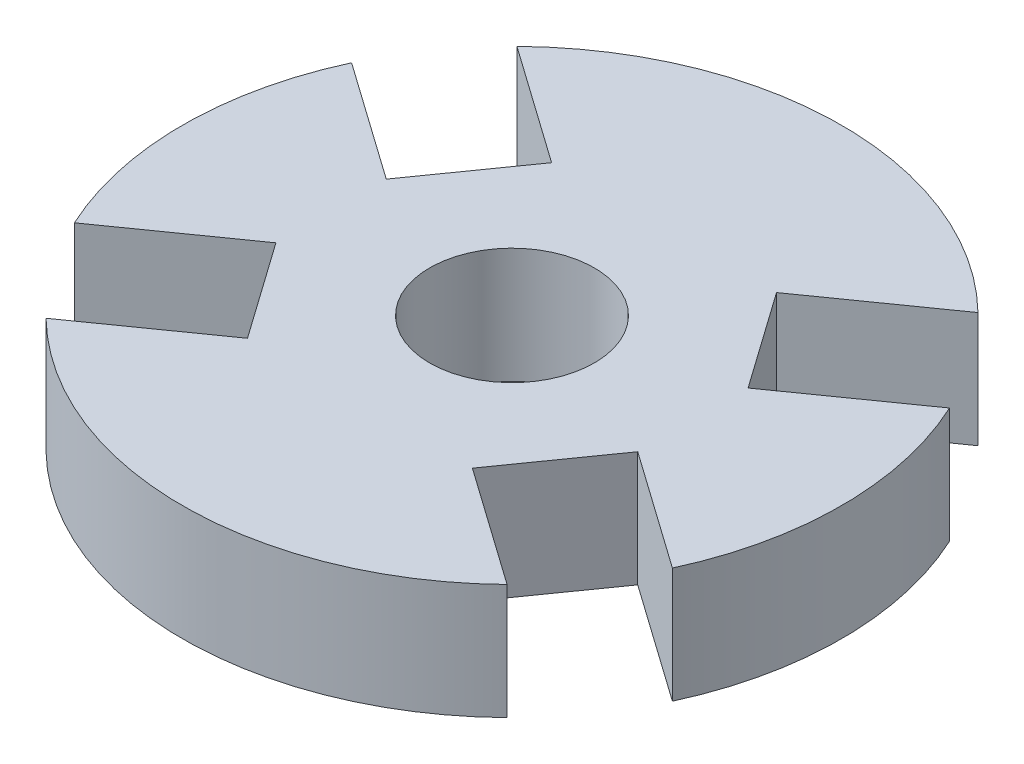
ISO-10303-21;
HEADER;
FILE_DESCRIPTION(('STEP AP214'),'2;1');
FILE_NAME('part.step','',(''),(''),'','','');
FILE_SCHEMA(('AUTOMOTIVE_DESIGN { 1 0 10303 214 1 1 1 1 }'));
ENDSEC;
DATA;
#1=APPLICATION_CONTEXT('core data for automotive mechanical design processes');
#2=APPLICATION_PROTOCOL_DEFINITION('international standard','automotive_design',2000,#1);
#3=PRODUCT_CONTEXT('',#1,'mechanical');
#4=PRODUCT('Part','Part','',(#3));
#5=PRODUCT_RELATED_PRODUCT_CATEGORY('part','',(#4));
#6=PRODUCT_DEFINITION_FORMATION('','',#4);
#7=PRODUCT_DEFINITION_CONTEXT('part definition',#1,'design');
#8=PRODUCT_DEFINITION('design','',#6,#7);
#9=PRODUCT_DEFINITION_SHAPE('','',#8);
#10=(LENGTH_UNIT() NAMED_UNIT(*) SI_UNIT(.MILLI.,.METRE.));
#11=(NAMED_UNIT(*) PLANE_ANGLE_UNIT() SI_UNIT($,.RADIAN.));
#12=(NAMED_UNIT(*) SI_UNIT($,.STERADIAN.) SOLID_ANGLE_UNIT());
#13=UNCERTAINTY_MEASURE_WITH_UNIT(LENGTH_MEASURE(1.E-05),#10,'distance_accuracy_value','');
#14=(GEOMETRIC_REPRESENTATION_CONTEXT(3) GLOBAL_UNCERTAINTY_ASSIGNED_CONTEXT((#13)) GLOBAL_UNIT_ASSIGNED_CONTEXT((#10,
#11,#12)) REPRESENTATION_CONTEXT('',''));
#15=CARTESIAN_POINT('',(0.,0.,0.));
#16=DIRECTION('',(0.,0.,1.));
#17=DIRECTION('',(1.,0.,0.));
#18=AXIS2_PLACEMENT_3D('',#15,#16,#17);
#19=CARTESIAN_POINT('',(0.,3.5,0.));
#20=DIRECTION('',(0.,-1.,0.));
#21=DIRECTION('',(0.,0.,-1.));
#22=AXIS2_PLACEMENT_3D('',#19,#20,#21);
#23=CYLINDRICAL_SURFACE('',#22,9.99999999999999);
#24=CARTESIAN_POINT('',(0.,0.,0.));
#25=DIRECTION('',(0.,1.,0.));
#26=DIRECTION('',(0.,0.,1.));
#27=AXIS2_PLACEMENT_3D('',#24,#25,#26);
#28=CIRCLE('',#27,9.99999999999999);
#29=CARTESIAN_POINT('',(6.99580233800451,0.,-7.14554054271407));
#30=VERTEX_POINT('',#29);
#31=CARTESIAN_POINT('',(-6.99580233800451,0.,-7.14554054271407));
#32=VERTEX_POINT('',#31);
#33=EDGE_CURVE('E254',#30,#32,#28,.T.);
#34=ORIENTED_EDGE('',*,*,#33,.T.);
#35=DIRECTION('',(0.,-1.,0.));
#36=VECTOR('',#35,1.);
#37=CARTESIAN_POINT('',(-6.99580233800451,3.5,-7.14554054271407));
#38=LINE('',#37,#36);
#39=CARTESIAN_POINT('',(-6.99580233800451,3.5,-7.14554054271407));
#40=VERTEX_POINT('',#39);
#41=EDGE_CURVE('E159',#32,#40,#38,.F.);
#42=ORIENTED_EDGE('',*,*,#41,.T.);
#43=CARTESIAN_POINT('',(0.,3.5,0.));
#44=DIRECTION('',(0.,1.,0.));
#45=DIRECTION('',(0.,0.,1.));
#46=AXIS2_PLACEMENT_3D('',#43,#44,#45);
#47=CIRCLE('',#46,9.99999999999999);
#48=CARTESIAN_POINT('',(6.99580233800451,3.5,-7.14554054271407));
#49=VERTEX_POINT('',#48);
#50=EDGE_CURVE('E248',#49,#40,#47,.T.);
#51=ORIENTED_EDGE('',*,*,#50,.F.);
#52=DIRECTION('',(0.,-1.,0.));
#53=VECTOR('',#52,1.);
#54=CARTESIAN_POINT('',(6.99580233800451,3.5,-7.14554054271407));
#55=LINE('',#54,#53);
#56=EDGE_CURVE('E261',#49,#30,#55,.T.);
#57=ORIENTED_EDGE('',*,*,#56,.T.);
#58=EDGE_LOOP('',(#34,#42,#51,#57));
#59=FACE_BOUND('',#58,.T.);
#60=ADVANCED_FACE('F33',(#59),#23,.T.);
#61=CARTESIAN_POINT('',(-6.99580233800451,0.,7.14554054271407));
#62=VERTEX_POINT('',#61);
#63=CARTESIAN_POINT('',(6.99580233800451,0.,7.14554054271407));
#64=VERTEX_POINT('',#63);
#65=EDGE_CURVE('E258',#62,#64,#28,.T.);
#66=ORIENTED_EDGE('',*,*,#65,.T.);
#67=DIRECTION('',(0.,-1.,0.));
#68=VECTOR('',#67,1.);
#69=CARTESIAN_POINT('',(6.99580233800451,3.5,7.14554054271407));
#70=LINE('',#69,#68);
#71=CARTESIAN_POINT('',(6.99580233800451,3.5,7.14554054271407));
#72=VERTEX_POINT('',#71);
#73=EDGE_CURVE('E41',#64,#72,#70,.F.);
#74=ORIENTED_EDGE('',*,*,#73,.T.);
#75=CARTESIAN_POINT('',(-6.99580233800451,3.5,7.14554054271407));
#76=VERTEX_POINT('',#75);
#77=EDGE_CURVE('E253',#76,#72,#47,.T.);
#78=ORIENTED_EDGE('',*,*,#77,.F.);
#79=DIRECTION('',(0.,-1.,0.));
#80=VECTOR('',#79,1.);
#81=CARTESIAN_POINT('',(-6.99580233800451,3.5,7.14554054271407));
#82=LINE('',#81,#80);
#83=EDGE_CURVE('E264',#76,#62,#82,.T.);
#84=ORIENTED_EDGE('',*,*,#83,.T.);
#85=EDGE_LOOP('',(#66,#74,#78,#84));
#86=FACE_BOUND('',#85,.T.);
#87=ADVANCED_FACE('F276',(#86),#23,.T.);
#88=CARTESIAN_POINT('',(-9.07285301820394,3.5,-4.20515613385133));
#89=VERTEX_POINT('',#88);
#90=CARTESIAN_POINT('',(-9.07285301820394,3.5,4.20515613385133));
#91=VERTEX_POINT('',#90);
#92=EDGE_CURVE('E252',#89,#91,#47,.T.);
#93=ORIENTED_EDGE('',*,*,#92,.F.);
#94=DIRECTION('',(0.,-1.,0.));
#95=VECTOR('',#94,1.);
#96=CARTESIAN_POINT('',(-9.07285301820394,3.5,-4.20515613385133));
#97=LINE('',#96,#95);
#98=CARTESIAN_POINT('',(-9.07285301820394,0.,-4.20515613385133));
#99=VERTEX_POINT('',#98);
#100=EDGE_CURVE('E152',#89,#99,#97,.T.);
#101=ORIENTED_EDGE('',*,*,#100,.T.);
#102=CARTESIAN_POINT('',(-9.07285301820394,0.,4.20515613385133));
#103=VERTEX_POINT('',#102);
#104=EDGE_CURVE('E257',#99,#103,#28,.T.);
#105=ORIENTED_EDGE('',*,*,#104,.T.);
#106=DIRECTION('',(0.,-1.,0.));
#107=VECTOR('',#106,1.);
#108=CARTESIAN_POINT('',(-9.07285301820394,3.5,4.20515613385133));
#109=LINE('',#108,#107);
#110=EDGE_CURVE('E267',#103,#91,#109,.F.);
#111=ORIENTED_EDGE('',*,*,#110,.T.);
#112=EDGE_LOOP('',(#93,#101,#105,#111));
#113=FACE_BOUND('',#112,.T.);
#114=ADVANCED_FACE('F300',(#113),#23,.T.);
#115=CARTESIAN_POINT('',(0.,3.5,0.));
#116=DIRECTION('',(0.,1.,0.));
#117=DIRECTION('',(0.,0.,1.));
#118=AXIS2_PLACEMENT_3D('',#115,#116,#117);
#119=PLANE('',#118);
#120=DIRECTION('',(-0.816773446906317,0.,-0.576958522277619));
#121=VECTOR('',#120,1.);
#122=CARTESIAN_POINT('',(-10.8455283123872,3.5,-9.86493870357073));
#123=LINE('',#122,#121);
#124=CARTESIAN_POINT('',(-3.4128899455397,3.5,-4.61461615084439));
#125=VERTEX_POINT('',#124);
#126=EDGE_CURVE('E167',#125,#40,#123,.T.);
#127=ORIENTED_EDGE('',*,*,#126,.F.);
#128=DIRECTION('',(0.576958522277619,0.,-0.816773446906317));
#129=VECTOR('',#128,1.);
#130=CARTESIAN_POINT('',(-5.48994062573913,3.5,-1.67423174198165));
#131=LINE('',#130,#129);
#132=CARTESIAN_POINT('',(-5.48994062573913,3.5,-1.67423174198165));
#133=VERTEX_POINT('',#132);
#134=EDGE_CURVE('E149',#133,#125,#131,.T.);
#135=ORIENTED_EDGE('',*,*,#134,.F.);
#136=DIRECTION('',(0.816773446906317,0.,0.576958522277619));
#137=VECTOR('',#136,1.);
#138=CARTESIAN_POINT('',(-12.9225789925866,3.5,-6.92455429470799));
#139=LINE('',#138,#137);
#140=EDGE_CURVE('E171',#89,#133,#139,.T.);
#141=ORIENTED_EDGE('',*,*,#140,.F.);
#142=ORIENTED_EDGE('',*,*,#92,.T.);
#143=DIRECTION('',(-0.816773446906316,0.,0.57695852227762));
#144=VECTOR('',#143,1.);
#145=CARTESIAN_POINT('',(-12.9225789925866,3.5,6.924554294708));
#146=LINE('',#145,#144);
#147=CARTESIAN_POINT('',(-5.48994062573913,3.5,1.67423174198165));
#148=VERTEX_POINT('',#147);
#149=EDGE_CURVE('E202',#148,#91,#146,.T.);
#150=ORIENTED_EDGE('',*,*,#149,.F.);
#151=DIRECTION('',(-0.57695852227762,0.,-0.816773446906316));
#152=VECTOR('',#151,1.);
#153=CARTESIAN_POINT('',(-3.4128899455397,3.5,4.61461615084439));
#154=LINE('',#153,#152);
#155=CARTESIAN_POINT('',(-3.4128899455397,3.5,4.61461615084439));
#156=VERTEX_POINT('',#155);
#157=EDGE_CURVE('E210',#156,#148,#154,.T.);
#158=ORIENTED_EDGE('',*,*,#157,.F.);
#159=DIRECTION('',(0.816773446906316,0.,-0.57695852227762));
#160=VECTOR('',#159,1.);
#161=CARTESIAN_POINT('',(-10.8455283123872,3.5,9.86493870357073));
#162=LINE('',#161,#160);
#163=EDGE_CURVE('E195',#76,#156,#162,.T.);
#164=ORIENTED_EDGE('',*,*,#163,.F.);
#165=ORIENTED_EDGE('',*,*,#77,.T.);
#166=DIRECTION('',(0.816773446906316,0.,0.57695852227762));
#167=VECTOR('',#166,1.);
#168=CARTESIAN_POINT('',(10.8455283123872,3.5,9.86493870357073));
#169=LINE('',#168,#167);
#170=CARTESIAN_POINT('',(3.4128899455397,3.5,4.61461615084439));
#171=VERTEX_POINT('',#170);
#172=EDGE_CURVE('E181',#171,#72,#169,.T.);
#173=ORIENTED_EDGE('',*,*,#172,.F.);
#174=DIRECTION('',(-0.576958522277619,0.,0.816773446906317));
#175=VECTOR('',#174,1.);
#176=CARTESIAN_POINT('',(3.4128899455397,3.5,4.61461615084439));
#177=LINE('',#176,#175);
#178=CARTESIAN_POINT('',(5.48994062573913,3.5,1.67423174198165));
#179=VERTEX_POINT('',#178);
#180=EDGE_CURVE('E189',#179,#171,#177,.T.);
#181=ORIENTED_EDGE('',*,*,#180,.F.);
#182=DIRECTION('',(-0.816773446906316,0.,-0.57695852227762));
#183=VECTOR('',#182,1.);
#184=CARTESIAN_POINT('',(12.9225789925866,3.5,6.92455429470799));
#185=LINE('',#184,#183);
#186=CARTESIAN_POINT('',(9.07285301820394,3.5,4.20515613385133));
#187=VERTEX_POINT('',#186);
#188=EDGE_CURVE('E178',#187,#179,#185,.T.);
#189=ORIENTED_EDGE('',*,*,#188,.F.);
#190=CARTESIAN_POINT('',(9.07285301820394,3.5,-4.20515613385133));
#191=VERTEX_POINT('',#190);
#192=EDGE_CURVE('E256',#187,#191,#47,.T.);
#193=ORIENTED_EDGE('',*,*,#192,.T.);
#194=DIRECTION('',(0.816773446906316,0.,-0.57695852227762));
#195=VECTOR('',#194,1.);
#196=CARTESIAN_POINT('',(12.9225789925866,3.5,-6.92455429470799));
#197=LINE('',#196,#195);
#198=CARTESIAN_POINT('',(5.48994062573913,3.5,-1.67423174198165));
#199=VERTEX_POINT('',#198);
#200=EDGE_CURVE('E233',#199,#191,#197,.T.);
#201=ORIENTED_EDGE('',*,*,#200,.F.);
#202=DIRECTION('',(0.576958522277619,0.,0.816773446906317));
#203=VECTOR('',#202,1.);
#204=CARTESIAN_POINT('',(5.48994062573913,3.5,-1.67423174198165));
#205=LINE('',#204,#203);
#206=CARTESIAN_POINT('',(3.4128899455397,3.5,-4.61461615084439));
#207=VERTEX_POINT('',#206);
#208=EDGE_CURVE('E217',#207,#199,#205,.T.);
#209=ORIENTED_EDGE('',*,*,#208,.F.);
#210=DIRECTION('',(-0.816773446906316,0.,0.57695852227762));
#211=VECTOR('',#210,1.);
#212=CARTESIAN_POINT('',(10.8455283123872,3.5,-9.86493870357073));
#213=LINE('',#212,#211);
#214=EDGE_CURVE('E224',#49,#207,#213,.T.);
#215=ORIENTED_EDGE('',*,*,#214,.F.);
#216=ORIENTED_EDGE('',*,*,#50,.T.);
#217=EDGE_LOOP('',(#127,#135,#141,#142,#150,#158,#164,#165,#173,#181,#189,#193,#201,#209,#215,#216));
#218=FACE_BOUND('',#217,.T.);
#219=CARTESIAN_POINT('',(0.,3.5,0.));
#220=DIRECTION('',(0.,1.,0.));
#221=DIRECTION('',(0.,0.,1.));
#222=AXIS2_PLACEMENT_3D('',#219,#220,#221);
#223=CIRCLE('',#222,2.5);
#224=CARTESIAN_POINT('',(0.,3.5,2.5));
#225=VERTEX_POINT('',#224);
#226=EDGE_CURVE('E242',#225,#225,#223,.T.);
#227=ORIENTED_EDGE('',*,*,#226,.F.);
#228=EDGE_LOOP('',(#227));
#229=FACE_BOUND('',#228,.T.);
#230=ADVANCED_FACE('F283',(#218,#229),#119,.T.);
#231=CARTESIAN_POINT('',(0.,0.,0.));
#232=DIRECTION('',(0.,1.,0.));
#233=DIRECTION('',(0.,0.,1.));
#234=AXIS2_PLACEMENT_3D('',#231,#232,#233);
#235=PLANE('',#234);
#236=DIRECTION('',(0.576958522277619,0.,-0.816773446906317));
#237=VECTOR('',#236,1.);
#238=CARTESIAN_POINT('',(-5.48994062573913,0.,-1.67423174198165));
#239=LINE('',#238,#237);
#240=CARTESIAN_POINT('',(-5.48994062573913,0.,-1.67423174198165));
#241=VERTEX_POINT('',#240);
#242=CARTESIAN_POINT('',(-3.4128899455397,0.,-4.61461615084439));
#243=VERTEX_POINT('',#242);
#244=EDGE_CURVE('E48',#241,#243,#239,.T.);
#245=ORIENTED_EDGE('',*,*,#244,.T.);
#246=DIRECTION('',(-0.816773446906317,0.,-0.576958522277619));
#247=VECTOR('',#246,1.);
#248=CARTESIAN_POINT('',(-10.8455283123872,0.,-9.86493870357073));
#249=LINE('',#248,#247);
#250=EDGE_CURVE('E156',#243,#32,#249,.T.);
#251=ORIENTED_EDGE('',*,*,#250,.T.);
#252=ORIENTED_EDGE('',*,*,#33,.F.);
#253=DIRECTION('',(-0.816773446906316,0.,0.57695852227762));
#254=VECTOR('',#253,1.);
#255=CARTESIAN_POINT('',(10.8455283123872,0.,-9.86493870357073));
#256=LINE('',#255,#254);
#257=CARTESIAN_POINT('',(3.4128899455397,0.,-4.61461615084439));
#258=VERTEX_POINT('',#257);
#259=EDGE_CURVE('E227',#30,#258,#256,.T.);
#260=ORIENTED_EDGE('',*,*,#259,.T.);
#261=DIRECTION('',(0.576958522277619,0.,0.816773446906317));
#262=VECTOR('',#261,1.);
#263=CARTESIAN_POINT('',(5.48994062573913,0.,-1.67423174198165));
#264=LINE('',#263,#262);
#265=CARTESIAN_POINT('',(5.48994062573913,0.,-1.67423174198165));
#266=VERTEX_POINT('',#265);
#267=EDGE_CURVE('E220',#258,#266,#264,.T.);
#268=ORIENTED_EDGE('',*,*,#267,.T.);
#269=DIRECTION('',(0.816773446906316,0.,-0.57695852227762));
#270=VECTOR('',#269,1.);
#271=CARTESIAN_POINT('',(12.9225789925866,0.,-6.92455429470799));
#272=LINE('',#271,#270);
#273=CARTESIAN_POINT('',(9.07285301820394,0.,-4.20515613385133));
#274=VERTEX_POINT('',#273);
#275=EDGE_CURVE('E223',#266,#274,#272,.T.);
#276=ORIENTED_EDGE('',*,*,#275,.T.);
#277=CARTESIAN_POINT('',(9.07285301820394,0.,4.20515613385133));
#278=VERTEX_POINT('',#277);
#279=EDGE_CURVE('E245',#278,#274,#28,.T.);
#280=ORIENTED_EDGE('',*,*,#279,.F.);
#281=DIRECTION('',(-0.816773446906316,0.,-0.57695852227762));
#282=VECTOR('',#281,1.);
#283=CARTESIAN_POINT('',(12.9225789925866,0.,6.92455429470799));
#284=LINE('',#283,#282);
#285=CARTESIAN_POINT('',(5.48994062573913,0.,1.67423174198165));
#286=VERTEX_POINT('',#285);
#287=EDGE_CURVE('E56',#278,#286,#284,.T.);
#288=ORIENTED_EDGE('',*,*,#287,.T.);
#289=DIRECTION('',(-0.576958522277619,0.,0.816773446906317));
#290=VECTOR('',#289,1.);
#291=CARTESIAN_POINT('',(3.4128899455397,0.,4.61461615084439));
#292=LINE('',#291,#290);
#293=CARTESIAN_POINT('',(3.4128899455397,0.,4.61461615084439));
#294=VERTEX_POINT('',#293);
#295=EDGE_CURVE('E180',#286,#294,#292,.T.);
#296=ORIENTED_EDGE('',*,*,#295,.T.);
#297=DIRECTION('',(0.816773446906316,0.,0.57695852227762));
#298=VECTOR('',#297,1.);
#299=CARTESIAN_POINT('',(10.8455283123872,0.,9.86493870357073));
#300=LINE('',#299,#298);
#301=EDGE_CURVE('E184',#294,#64,#300,.T.);
#302=ORIENTED_EDGE('',*,*,#301,.T.);
#303=ORIENTED_EDGE('',*,*,#65,.F.);
#304=DIRECTION('',(0.816773446906316,0.,-0.57695852227762));
#305=VECTOR('',#304,1.);
#306=CARTESIAN_POINT('',(-10.8455283123872,0.,9.86493870357073));
#307=LINE('',#306,#305);
#308=CARTESIAN_POINT('',(-3.4128899455397,0.,4.61461615084439));
#309=VERTEX_POINT('',#308);
#310=EDGE_CURVE('E198',#62,#309,#307,.T.);
#311=ORIENTED_EDGE('',*,*,#310,.T.);
#312=DIRECTION('',(-0.57695852227762,0.,-0.816773446906316));
#313=VECTOR('',#312,1.);
#314=CARTESIAN_POINT('',(-3.4128899455397,0.,4.61461615084439));
#315=LINE('',#314,#313);
#316=CARTESIAN_POINT('',(-5.48994062573913,0.,1.67423174198165));
#317=VERTEX_POINT('',#316);
#318=EDGE_CURVE('E201',#309,#317,#315,.T.);
#319=ORIENTED_EDGE('',*,*,#318,.T.);
#320=DIRECTION('',(-0.816773446906316,0.,0.57695852227762));
#321=VECTOR('',#320,1.);
#322=CARTESIAN_POINT('',(-12.9225789925866,0.,6.924554294708));
#323=LINE('',#322,#321);
#324=EDGE_CURVE('E205',#317,#103,#323,.T.);
#325=ORIENTED_EDGE('',*,*,#324,.T.);
#326=ORIENTED_EDGE('',*,*,#104,.F.);
#327=DIRECTION('',(0.816773446906317,0.,0.576958522277619));
#328=VECTOR('',#327,1.);
#329=CARTESIAN_POINT('',(-1.03852534009971,0.,1.47019220443137));
#330=LINE('',#329,#328);
#331=EDGE_CURVE('E11',#99,#241,#330,.T.);
#332=ORIENTED_EDGE('',*,*,#331,.T.);
#333=EDGE_LOOP('',(#245,#251,#252,#260,#268,#276,#280,#288,#296,#302,#303,#311,#319,#325,#326,#332));
#334=FACE_BOUND('',#333,.T.);
#335=CARTESIAN_POINT('',(0.,0.,0.));
#336=DIRECTION('',(0.,1.,0.));
#337=DIRECTION('',(0.,0.,1.));
#338=AXIS2_PLACEMENT_3D('',#335,#336,#337);
#339=CIRCLE('',#338,2.5);
#340=CARTESIAN_POINT('',(0.,0.,2.5));
#341=VERTEX_POINT('',#340);
#342=EDGE_CURVE('E240',#341,#341,#339,.T.);
#343=ORIENTED_EDGE('',*,*,#342,.T.);
#344=EDGE_LOOP('',(#343));
#345=FACE_BOUND('',#344,.T.);
#346=ADVANCED_FACE('F164',(#334,#345),#235,.F.);
#347=ORIENTED_EDGE('',*,*,#192,.F.);
#348=DIRECTION('',(0.,-1.,0.));
#349=VECTOR('',#348,1.);
#350=CARTESIAN_POINT('',(9.07285301820394,3.5,4.20515613385133));
#351=LINE('',#350,#349);
#352=EDGE_CURVE('E270',#187,#278,#351,.T.);
#353=ORIENTED_EDGE('',*,*,#352,.T.);
#354=ORIENTED_EDGE('',*,*,#279,.T.);
#355=DIRECTION('',(0.,-1.,0.));
#356=VECTOR('',#355,1.);
#357=CARTESIAN_POINT('',(9.07285301820394,3.5,-4.20515613385133));
#358=LINE('',#357,#356);
#359=EDGE_CURVE('E251',#274,#191,#358,.F.);
#360=ORIENTED_EDGE('',*,*,#359,.T.);
#361=EDGE_LOOP('',(#347,#353,#354,#360));
#362=FACE_BOUND('',#361,.T.);
#363=ADVANCED_FACE('F35',(#362),#23,.T.);
#364=CARTESIAN_POINT('',(0.,3.5,0.));
#365=DIRECTION('',(0.,-1.,0.));
#366=DIRECTION('',(0.,0.,-1.));
#367=AXIS2_PLACEMENT_3D('',#364,#365,#366);
#368=CYLINDRICAL_SURFACE('',#367,2.5);
#369=ORIENTED_EDGE('',*,*,#226,.T.);
#370=EDGE_LOOP('',(#369));
#371=FACE_BOUND('',#370,.T.);
#372=ORIENTED_EDGE('',*,*,#342,.F.);
#373=EDGE_LOOP('',(#372));
#374=FACE_BOUND('',#373,.T.);
#375=ADVANCED_FACE('F327',(#371,#374),#368,.F.);
#376=CARTESIAN_POINT('',(10.8455283123872,0.,-9.86493870357073));
#377=DIRECTION('',(-0.57695852227762,0.,-0.816773446906316));
#378=DIRECTION('',(-0.816773446906317,0.,0.57695852227762));
#379=AXIS2_PLACEMENT_3D('',#376,#377,#378);
#380=PLANE('',#379);
#381=ORIENTED_EDGE('',*,*,#214,.T.);
#382=DIRECTION('',(0.,1.,0.));
#383=VECTOR('',#382,1.);
#384=CARTESIAN_POINT('',(3.4128899455397,0.,-4.61461615084439));
#385=LINE('',#384,#383);
#386=EDGE_CURVE('E237',#258,#207,#385,.T.);
#387=ORIENTED_EDGE('',*,*,#386,.F.);
#388=ORIENTED_EDGE('',*,*,#259,.F.);
#389=ORIENTED_EDGE('',*,*,#56,.F.);
#390=EDGE_LOOP('',(#381,#387,#388,#389));
#391=FACE_BOUND('',#390,.T.);
#392=ADVANCED_FACE('F332',(#391),#380,.F.);
#393=CARTESIAN_POINT('',(12.9225789925866,0.,-6.92455429470799));
#394=DIRECTION('',(0.57695852227762,0.,0.816773446906316));
#395=DIRECTION('',(0.816773446906316,0.,-0.57695852227762));
#396=AXIS2_PLACEMENT_3D('',#393,#394,#395);
#397=PLANE('',#396);
#398=ORIENTED_EDGE('',*,*,#275,.F.);
#399=DIRECTION('',(0.,1.,0.));
#400=VECTOR('',#399,1.);
#401=CARTESIAN_POINT('',(5.48994062573913,0.,-1.67423174198165));
#402=LINE('',#401,#400);
#403=EDGE_CURVE('E230',#266,#199,#402,.T.);
#404=ORIENTED_EDGE('',*,*,#403,.T.);
#405=ORIENTED_EDGE('',*,*,#200,.T.);
#406=ORIENTED_EDGE('',*,*,#359,.F.);
#407=EDGE_LOOP('',(#398,#404,#405,#406));
#408=FACE_BOUND('',#407,.T.);
#409=ADVANCED_FACE('F295',(#408),#397,.F.);
#410=CARTESIAN_POINT('',(5.48994062573913,0.,-1.67423174198165));
#411=DIRECTION('',(-0.816773446906317,0.,0.576958522277619));
#412=DIRECTION('',(0.576958522277619,0.,0.816773446906317));
#413=AXIS2_PLACEMENT_3D('',#410,#411,#412);
#414=PLANE('',#413);
#415=ORIENTED_EDGE('',*,*,#208,.T.);
#416=ORIENTED_EDGE('',*,*,#403,.F.);
#417=ORIENTED_EDGE('',*,*,#267,.F.);
#418=ORIENTED_EDGE('',*,*,#386,.T.);
#419=EDGE_LOOP('',(#415,#416,#417,#418));
#420=FACE_BOUND('',#419,.T.);
#421=ADVANCED_FACE('F343',(#420),#414,.F.);
#422=CARTESIAN_POINT('',(-12.9225789925866,0.,6.924554294708));
#423=DIRECTION('',(-0.57695852227762,0.,-0.816773446906316));
#424=DIRECTION('',(-0.816773446906316,0.,0.57695852227762));
#425=AXIS2_PLACEMENT_3D('',#422,#423,#424);
#426=PLANE('',#425);
#427=ORIENTED_EDGE('',*,*,#324,.F.);
#428=DIRECTION('',(0.,1.,0.));
#429=VECTOR('',#428,1.);
#430=CARTESIAN_POINT('',(-5.48994062573913,0.,1.67423174198165));
#431=LINE('',#430,#429);
#432=EDGE_CURVE('E215',#317,#148,#431,.T.);
#433=ORIENTED_EDGE('',*,*,#432,.T.);
#434=ORIENTED_EDGE('',*,*,#149,.T.);
#435=ORIENTED_EDGE('',*,*,#110,.F.);
#436=EDGE_LOOP('',(#427,#433,#434,#435));
#437=FACE_BOUND('',#436,.T.);
#438=ADVANCED_FACE('F303',(#437),#426,.F.);
#439=CARTESIAN_POINT('',(-10.8455283123872,0.,9.86493870357073));
#440=DIRECTION('',(0.57695852227762,0.,0.816773446906316));
#441=DIRECTION('',(0.816773446906316,0.,-0.57695852227762));
#442=AXIS2_PLACEMENT_3D('',#439,#440,#441);
#443=PLANE('',#442);
#444=ORIENTED_EDGE('',*,*,#163,.T.);
#445=DIRECTION('',(0.,1.,0.));
#446=VECTOR('',#445,1.);
#447=CARTESIAN_POINT('',(-3.4128899455397,0.,4.61461615084439));
#448=LINE('',#447,#446);
#449=EDGE_CURVE('E208',#309,#156,#448,.T.);
#450=ORIENTED_EDGE('',*,*,#449,.F.);
#451=ORIENTED_EDGE('',*,*,#310,.F.);
#452=ORIENTED_EDGE('',*,*,#83,.F.);
#453=EDGE_LOOP('',(#444,#450,#451,#452));
#454=FACE_BOUND('',#453,.T.);
#455=ADVANCED_FACE('F352',(#454),#443,.F.);
#456=CARTESIAN_POINT('',(-3.4128899455397,0.,4.61461615084439));
#457=DIRECTION('',(0.816773446906316,0.,-0.57695852227762));
#458=DIRECTION('',(-0.57695852227762,0.,-0.816773446906316));
#459=AXIS2_PLACEMENT_3D('',#456,#457,#458);
#460=PLANE('',#459);
#461=ORIENTED_EDGE('',*,*,#157,.T.);
#462=ORIENTED_EDGE('',*,*,#432,.F.);
#463=ORIENTED_EDGE('',*,*,#318,.F.);
#464=ORIENTED_EDGE('',*,*,#449,.T.);
#465=EDGE_LOOP('',(#461,#462,#463,#464));
#466=FACE_BOUND('',#465,.T.);
#467=ADVANCED_FACE('F307',(#466),#460,.F.);
#468=CARTESIAN_POINT('',(10.8455283123872,0.,9.86493870357073));
#469=DIRECTION('',(-0.57695852227762,0.,0.816773446906316));
#470=DIRECTION('',(0.816773446906317,0.,0.57695852227762));
#471=AXIS2_PLACEMENT_3D('',#468,#469,#470);
#472=PLANE('',#471);
#473=ORIENTED_EDGE('',*,*,#301,.F.);
#474=DIRECTION('',(0.,1.,0.));
#475=VECTOR('',#474,1.);
#476=CARTESIAN_POINT('',(3.4128899455397,0.,4.61461615084439));
#477=LINE('',#476,#475);
#478=EDGE_CURVE('E193',#294,#171,#477,.T.);
#479=ORIENTED_EDGE('',*,*,#478,.T.);
#480=ORIENTED_EDGE('',*,*,#172,.T.);
#481=ORIENTED_EDGE('',*,*,#73,.F.);
#482=EDGE_LOOP('',(#473,#479,#480,#481));
#483=FACE_BOUND('',#482,.T.);
#484=ADVANCED_FACE('F358',(#483),#472,.F.);
#485=CARTESIAN_POINT('',(12.9225789925866,0.,6.92455429470799));
#486=DIRECTION('',(0.57695852227762,0.,-0.816773446906316));
#487=DIRECTION('',(-0.816773446906316,0.,-0.57695852227762));
#488=AXIS2_PLACEMENT_3D('',#485,#486,#487);
#489=PLANE('',#488);
#490=ORIENTED_EDGE('',*,*,#188,.T.);
#491=DIRECTION('',(0.,1.,0.));
#492=VECTOR('',#491,1.);
#493=CARTESIAN_POINT('',(5.48994062573913,0.,1.67423174198165));
#494=LINE('',#493,#492);
#495=EDGE_CURVE('E187',#286,#179,#494,.T.);
#496=ORIENTED_EDGE('',*,*,#495,.F.);
#497=ORIENTED_EDGE('',*,*,#287,.F.);
#498=ORIENTED_EDGE('',*,*,#352,.F.);
#499=EDGE_LOOP('',(#490,#496,#497,#498));
#500=FACE_BOUND('',#499,.T.);
#501=ADVANCED_FACE('F361',(#500),#489,.F.);
#502=CARTESIAN_POINT('',(3.4128899455397,0.,4.61461615084439));
#503=DIRECTION('',(-0.816773446906317,0.,-0.576958522277619));
#504=DIRECTION('',(-0.576958522277619,0.,0.816773446906317));
#505=AXIS2_PLACEMENT_3D('',#502,#503,#504);
#506=PLANE('',#505);
#507=ORIENTED_EDGE('',*,*,#180,.T.);
#508=ORIENTED_EDGE('',*,*,#478,.F.);
#509=ORIENTED_EDGE('',*,*,#295,.F.);
#510=ORIENTED_EDGE('',*,*,#495,.T.);
#511=EDGE_LOOP('',(#507,#508,#509,#510));
#512=FACE_BOUND('',#511,.T.);
#513=ADVANCED_FACE('F318',(#512),#506,.F.);
#514=CARTESIAN_POINT('',(-10.8455283123872,0.,-9.86493870357073));
#515=DIRECTION('',(0.576958522277619,0.,-0.816773446906317));
#516=DIRECTION('',(-0.816773446906317,0.,-0.576958522277619));
#517=AXIS2_PLACEMENT_3D('',#514,#515,#516);
#518=PLANE('',#517);
#519=ORIENTED_EDGE('',*,*,#250,.F.);
#520=DIRECTION('',(0.,1.,0.));
#521=VECTOR('',#520,1.);
#522=CARTESIAN_POINT('',(-3.4128899455397,0.,-4.61461615084439));
#523=LINE('',#522,#521);
#524=EDGE_CURVE('E145',#243,#125,#523,.T.);
#525=ORIENTED_EDGE('',*,*,#524,.T.);
#526=ORIENTED_EDGE('',*,*,#126,.T.);
#527=ORIENTED_EDGE('',*,*,#41,.F.);
#528=EDGE_LOOP('',(#519,#525,#526,#527));
#529=FACE_BOUND('',#528,.T.);
#530=ADVANCED_FACE('F157',(#529),#518,.F.);
#531=CARTESIAN_POINT('',(-12.9225789925866,0.,-6.92455429470799));
#532=DIRECTION('',(-0.576958522277619,0.,0.816773446906317));
#533=DIRECTION('',(0.816773446906317,0.,0.576958522277619));
#534=AXIS2_PLACEMENT_3D('',#531,#532,#533);
#535=PLANE('',#534);
#536=ORIENTED_EDGE('',*,*,#140,.T.);
#537=DIRECTION('',(0.,1.,0.));
#538=VECTOR('',#537,1.);
#539=CARTESIAN_POINT('',(-5.48994062573913,0.,-1.67423174198165));
#540=LINE('',#539,#538);
#541=EDGE_CURVE('E153',#241,#133,#540,.T.);
#542=ORIENTED_EDGE('',*,*,#541,.F.);
#543=ORIENTED_EDGE('',*,*,#331,.F.);
#544=ORIENTED_EDGE('',*,*,#100,.F.);
#545=EDGE_LOOP('',(#536,#542,#543,#544));
#546=FACE_BOUND('',#545,.T.);
#547=ADVANCED_FACE('F310',(#546),#535,.F.);
#548=CARTESIAN_POINT('',(-5.48994062573913,0.,-1.67423174198165));
#549=DIRECTION('',(0.816773446906317,0.,0.576958522277619));
#550=DIRECTION('',(0.576958522277619,0.,-0.816773446906317));
#551=AXIS2_PLACEMENT_3D('',#548,#549,#550);
#552=PLANE('',#551);
#553=ORIENTED_EDGE('',*,*,#134,.T.);
#554=ORIENTED_EDGE('',*,*,#524,.F.);
#555=ORIENTED_EDGE('',*,*,#244,.F.);
#556=ORIENTED_EDGE('',*,*,#541,.T.);
#557=EDGE_LOOP('',(#553,#554,#555,#556));
#558=FACE_BOUND('',#557,.T.);
#559=ADVANCED_FACE('F147',(#558),#552,.F.);
#560=CLOSED_SHELL('',(#60,#87,#114,#230,#346,#363,#375,#392,#409,#421,#438,#455,#467,#484,#501,
#513,#530,#547,#559));
#561=MANIFOLD_SOLID_BREP('B2',#560);
#562=ADVANCED_BREP_SHAPE_REPRESENTATION('',(#18,#561),#14);
#563=SHAPE_DEFINITION_REPRESENTATION(#9,#562);
ENDSEC;
END-ISO-10303-21;
